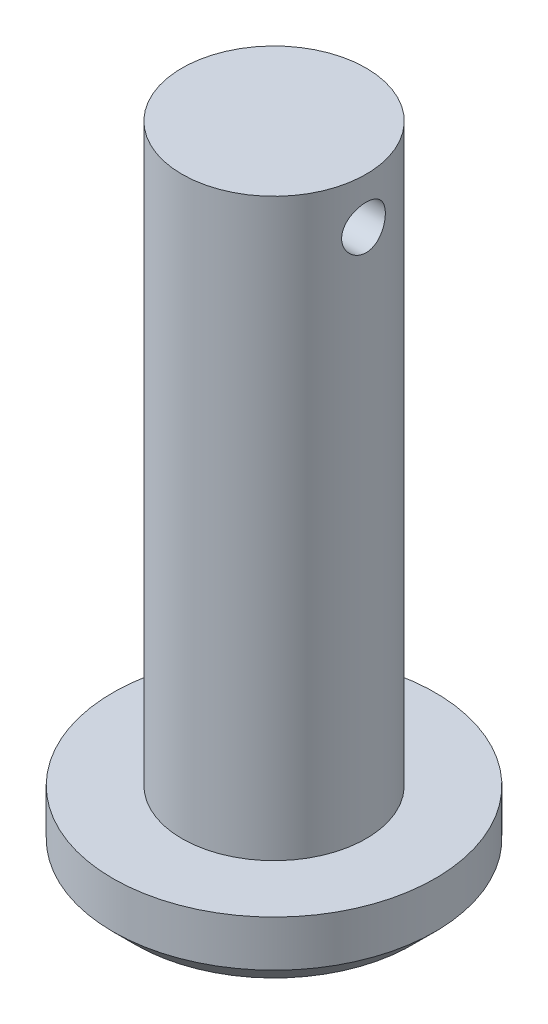
ISO-10303-21;
HEADER;
FILE_DESCRIPTION(('STEP AP214'),'2;1');
FILE_NAME('part.step','',(''),(''),'','','');
FILE_SCHEMA(('AUTOMOTIVE_DESIGN { 1 0 10303 214 1 1 1 1 }'));
ENDSEC;
DATA;
#1=APPLICATION_CONTEXT('core data for automotive mechanical design processes');
#2=APPLICATION_PROTOCOL_DEFINITION('international standard','automotive_design',2000,#1);
#3=PRODUCT_CONTEXT('',#1,'mechanical');
#4=PRODUCT('Part','Part','',(#3));
#5=PRODUCT_RELATED_PRODUCT_CATEGORY('part','',(#4));
#6=PRODUCT_DEFINITION_FORMATION('','',#4);
#7=PRODUCT_DEFINITION_CONTEXT('part definition',#1,'design');
#8=PRODUCT_DEFINITION('design','',#6,#7);
#9=PRODUCT_DEFINITION_SHAPE('','',#8);
#10=(LENGTH_UNIT() NAMED_UNIT(*) SI_UNIT(.MILLI.,.METRE.));
#11=(NAMED_UNIT(*) PLANE_ANGLE_UNIT() SI_UNIT($,.RADIAN.));
#12=(NAMED_UNIT(*) SI_UNIT($,.STERADIAN.) SOLID_ANGLE_UNIT());
#13=UNCERTAINTY_MEASURE_WITH_UNIT(LENGTH_MEASURE(1.E-05),#10,'distance_accuracy_value','');
#14=(GEOMETRIC_REPRESENTATION_CONTEXT(3) GLOBAL_UNCERTAINTY_ASSIGNED_CONTEXT((#13)) GLOBAL_UNIT_ASSIGNED_CONTEXT((#10,
#11,#12)) REPRESENTATION_CONTEXT('',''));
#15=CARTESIAN_POINT('',(0.,0.,0.));
#16=DIRECTION('',(0.,0.,1.));
#17=DIRECTION('',(1.,0.,0.));
#18=AXIS2_PLACEMENT_3D('',#15,#16,#17);
#19=CARTESIAN_POINT('',(0.,-3.,0.));
#20=DIRECTION('',(0.,1.,0.));
#21=DIRECTION('',(0.,0.,1.));
#22=AXIS2_PLACEMENT_3D('',#19,#20,#21);
#23=CYLINDRICAL_SURFACE('',#22,7.);
#24=CARTESIAN_POINT('',(0.,-2.,0.));
#25=DIRECTION('',(0.,1.,0.));
#26=DIRECTION('',(0.,0.,1.));
#27=AXIS2_PLACEMENT_3D('',#24,#25,#26);
#28=CIRCLE('',#27,7.);
#29=CARTESIAN_POINT('',(0.,-2.,7.));
#30=VERTEX_POINT('',#29);
#31=EDGE_CURVE('E41',#30,#30,#28,.T.);
#32=ORIENTED_EDGE('',*,*,#31,.T.);
#33=EDGE_LOOP('',(#32));
#34=FACE_BOUND('',#33,.T.);
#35=CARTESIAN_POINT('',(0.,0.,0.));
#36=DIRECTION('',(0.,1.,0.));
#37=DIRECTION('',(0.,0.,1.));
#38=AXIS2_PLACEMENT_3D('',#35,#36,#37);
#39=CIRCLE('',#38,7.);
#40=CARTESIAN_POINT('',(0.,0.,7.));
#41=VERTEX_POINT('',#40);
#42=EDGE_CURVE('E98',#41,#41,#39,.T.);
#43=ORIENTED_EDGE('',*,*,#42,.F.);
#44=EDGE_LOOP('',(#43));
#45=FACE_BOUND('',#44,.T.);
#46=ADVANCED_FACE('F33',(#34,#45),#23,.T.);
#47=CARTESIAN_POINT('',(0.,-3.,0.));
#48=DIRECTION('',(0.,1.,0.));
#49=DIRECTION('',(0.,0.,1.));
#50=AXIS2_PLACEMENT_3D('',#47,#48,#49);
#51=PLANE('',#50);
#52=CARTESIAN_POINT('',(0.,-3.,0.));
#53=DIRECTION('',(0.,1.,0.));
#54=DIRECTION('',(0.,0.,1.));
#55=AXIS2_PLACEMENT_3D('',#52,#53,#54);
#56=CIRCLE('',#55,6.);
#57=CARTESIAN_POINT('',(0.,-3.,6.));
#58=VERTEX_POINT('',#57);
#59=EDGE_CURVE('E10',#58,#58,#56,.F.);
#60=ORIENTED_EDGE('',*,*,#59,.T.);
#61=EDGE_LOOP('',(#60));
#62=FACE_BOUND('',#61,.T.);
#63=ADVANCED_FACE('F83',(#62),#51,.F.);
#64=CARTESIAN_POINT('',(0.,0.,0.));
#65=DIRECTION('',(0.,1.,0.));
#66=DIRECTION('',(0.,0.,1.));
#67=AXIS2_PLACEMENT_3D('',#64,#65,#66);
#68=PLANE('',#67);
#69=CARTESIAN_POINT('',(0.,0.,0.));
#70=DIRECTION('',(0.,1.,0.));
#71=DIRECTION('',(0.,0.,1.));
#72=AXIS2_PLACEMENT_3D('',#69,#70,#71);
#73=CIRCLE('',#72,4.);
#74=CARTESIAN_POINT('',(0.,0.,4.));
#75=VERTEX_POINT('',#74);
#76=EDGE_CURVE('E49',#75,#75,#73,.T.);
#77=ORIENTED_EDGE('',*,*,#76,.F.);
#78=EDGE_LOOP('',(#77));
#79=FACE_BOUND('',#78,.T.);
#80=ORIENTED_EDGE('',*,*,#42,.T.);
#81=EDGE_LOOP('',(#80));
#82=FACE_BOUND('',#81,.T.);
#83=ADVANCED_FACE('F79',(#79,#82),#68,.T.);
#84=CARTESIAN_POINT('',(0.,25.,0.));
#85=DIRECTION('',(0.,-1.,0.));
#86=DIRECTION('',(0.,0.,-1.));
#87=AXIS2_PLACEMENT_3D('',#84,#85,#86);
#88=CYLINDRICAL_SURFACE('',#87,4.);
#89=CARTESIAN_POINT('',(3.88555015409659,23.,0.95));
#90=CARTESIAN_POINT('',(3.88555119658447,23.0525480392455,0.949998366385795));
#91=CARTESIAN_POINT('',(3.88662777084838,23.1051147727544,0.945625214347679));
#92=CARTESIAN_POINT('',(3.89080804298714,23.2087447799121,0.928272377596758));
#93=CARTESIAN_POINT('',(3.89391303822829,23.2598070694678,0.915287184591519));
#94=CARTESIAN_POINT('',(3.90177911038668,23.3589142527183,0.881149268434964));
#95=CARTESIAN_POINT('',(3.90653818260282,23.4069627162588,0.860006428752927));
#96=CARTESIAN_POINT('',(3.91717372245091,23.4988341555609,0.810182790178994));
#97=CARTESIAN_POINT('',(3.92305020873714,23.5426570607621,0.781501865442135));
#98=CARTESIAN_POINT('',(3.93538912387704,23.6257047708797,0.716807680169348));
#99=CARTESIAN_POINT('',(3.94186015741135,23.6648332417439,0.680672374015562));
#100=CARTESIAN_POINT('',(3.9545841222894,23.7365347549474,0.602358310692681));
#101=CARTESIAN_POINT('',(3.96083703468498,23.7691072289344,0.560179030101748));
#102=CARTESIAN_POINT('',(3.97251482162618,23.8271608764587,0.470320149807636));
#103=CARTESIAN_POINT('',(3.97792835730083,23.8525482278961,0.422578335238793));
#104=CARTESIAN_POINT('',(3.98721966649302,23.8949022119194,0.32335528155475));
#105=CARTESIAN_POINT('',(3.99109764390069,23.9118699625286,0.271874539966056));
#106=CARTESIAN_POINT('',(3.99682007391831,23.9365968296962,0.167638263268297));
#107=CARTESIAN_POINT('',(3.9987005602098,23.9445193216035,0.114923496016071));
#108=CARTESIAN_POINT('',(4.00034139793232,23.9514427687046,0.00888180404807678));
#109=CARTESIAN_POINT('',(4.00010203342113,23.9504449192147,-0.0444450376939718));
#110=CARTESIAN_POINT('',(3.99755726020232,23.9396752466734,-0.149066874564704));
#111=CARTESIAN_POINT('',(3.99529335320897,23.9300796635352,-0.200381171649832));
#112=CARTESIAN_POINT('',(3.98900175091233,23.9026691761224,-0.300649456938191));
#113=CARTESIAN_POINT('',(3.98497396714895,23.8848538596181,-0.349603326627059));
#114=CARTESIAN_POINT('',(3.97554232938614,23.8413615691556,-0.44423575484939));
#115=CARTESIAN_POINT('',(3.97012726618428,23.8156201933928,-0.489883551839132));
#116=CARTESIAN_POINT('',(3.9585111535359,23.7570549763501,-0.576274415240526));
#117=CARTESIAN_POINT('',(3.95230997950376,23.7242300118576,-0.617016702209653));
#118=CARTESIAN_POINT('',(3.93962089598158,23.6514783712545,-0.693490090116478));
#119=CARTESIAN_POINT('',(3.93312968327407,23.6113975533269,-0.729074148815464));
#120=CARTESIAN_POINT('',(3.92073236244736,23.5257695548755,-0.793046400952027));
#121=CARTESIAN_POINT('',(3.9148262764987,23.4802221673671,-0.821434321790251));
#122=CARTESIAN_POINT('',(3.90425726360328,23.3846867372124,-0.870290427474961));
#123=CARTESIAN_POINT('',(3.89959941652524,23.3346816204803,-0.890726398768537));
#124=CARTESIAN_POINT('',(3.89212129602027,23.2318090288732,-0.922857992618091));
#125=CARTESIAN_POINT('',(3.88930067238144,23.1789421015994,-0.934555281006106));
#126=CARTESIAN_POINT('',(3.88588903434823,23.0732019490553,-0.948640150073782));
#127=CARTESIAN_POINT('',(3.88524629151521,23.0203591352807,-0.951243768155168));
#128=CARTESIAN_POINT('',(3.88612290482417,22.9149943332638,-0.947656130744841));
#129=CARTESIAN_POINT('',(3.8876420832732,22.8624723190107,-0.941465598063381));
#130=CARTESIAN_POINT('',(3.89262209093516,22.7600212801005,-0.920654019411597));
#131=CARTESIAN_POINT('',(3.89605458670746,22.7100657754889,-0.906155910822367));
#132=CARTESIAN_POINT('',(3.90444812874248,22.6132935436561,-0.869275695627036));
#133=CARTESIAN_POINT('',(3.90940934212708,22.5664771602905,-0.846892726996903));
#134=CARTESIAN_POINT('',(3.92041218658714,22.4763886277408,-0.794416189355452));
#135=CARTESIAN_POINT('',(3.92647156008142,22.4331948777974,-0.764191829227684));
#136=CARTESIAN_POINT('',(3.93894313562688,22.3524129550158,-0.697058205673848));
#137=CARTESIAN_POINT('',(3.94535538966067,22.3148256110961,-0.660147955508432));
#138=CARTESIAN_POINT('',(3.95798355973407,22.2454635738074,-0.579704501599114));
#139=CARTESIAN_POINT('',(3.96419189239773,22.2138374472024,-0.536041793133145));
#140=CARTESIAN_POINT('',(3.9755635343327,22.1583676531393,-0.44389890135051));
#141=CARTESIAN_POINT('',(3.98072689630454,22.1345235931746,-0.395418961162978));
#142=CARTESIAN_POINT('',(3.98939535866095,22.0954908840695,-0.295342502269509));
#143=CARTESIAN_POINT('',(3.99291186453037,22.0802425496044,-0.243770296420001));
#144=CARTESIAN_POINT('',(3.99794009464609,22.0586515875868,-0.138701882707194));
#145=CARTESIAN_POINT('',(3.99945216577429,22.052307419093,-0.0852060093947546));
#146=CARTESIAN_POINT('',(4.0002885918271,22.0487844156731,0.020789606420504));
#147=CARTESIAN_POINT('',(3.99966552523578,22.0513853113033,0.0732817299154627));
#148=CARTESIAN_POINT('',(3.99641664154496,22.0651789935283,0.177058003591496));
#149=CARTESIAN_POINT('',(3.99379087371965,22.0763715687347,0.228342183460656));
#150=CARTESIAN_POINT('',(3.98683803404943,22.1069177268473,0.328041015431034));
#151=CARTESIAN_POINT('',(3.98251853700102,22.1262350015487,0.376467354169049));
#152=CARTESIAN_POINT('',(3.97263562042283,22.1724485471967,0.469418177614435));
#153=CARTESIAN_POINT('',(3.96707205816221,22.1993456878688,0.51394221379652));
#154=CARTESIAN_POINT('',(3.95515134706186,22.2606465162429,0.598881797617394));
#155=CARTESIAN_POINT('',(3.94877946304627,22.2952019731106,0.63918575089086));
#156=CARTESIAN_POINT('',(3.93603169626298,22.3705390503303,0.713497872024468));
#157=CARTESIAN_POINT('',(3.92965581289578,22.4113222105532,0.747504478179234));
#158=CARTESIAN_POINT('',(3.91750394866502,22.4987618594738,0.808800126119141));
#159=CARTESIAN_POINT('',(3.91173951716314,22.5455036798704,0.835969891162669));
#160=CARTESIAN_POINT('',(3.90161403146148,22.6430200906236,0.882024967652499));
#161=CARTESIAN_POINT('',(3.89725188640607,22.6937915077814,0.900916722837271));
#162=CARTESIAN_POINT('',(3.89115917080241,22.7871132481922,0.926831562053166));
#163=CARTESIAN_POINT('',(3.8890708196325,22.8291904802568,0.935501763545243));
#164=CARTESIAN_POINT('',(3.88626593244295,22.9141743558729,0.947086452900724));
#165=CARTESIAN_POINT('',(3.88554930263575,22.9570809425169,0.95000133426828));
#166=CARTESIAN_POINT('',(3.88555015409659,23.,0.95));
#167=B_SPLINE_CURVE_WITH_KNOTS('',3,(#89,#90,#91,#92,#93,#94,#95,#96,#97,#98,#99,#100,#101,#102,
#103,#104,#105,#106,#107,#108,#109,#110,#111,#112,#113,#114,#115,#116,#117,#118,#119,#120,#121,
#122,#123,#124,#125,#126,#127,#128,#129,#130,#131,#132,#133,#134,#135,#136,#137,#138,#139,#140,
#141,#142,#143,#144,#145,#146,#147,#148,#149,#150,#151,#152,#153,#154,#155,#156,#157,#158,#159,
#160,#161,#162,#163,#164,#165,#166),.UNSPECIFIED.,.T.,.F.,(4,2,2,2,2,2,2,2,2,2,2,2,2,2,2,2,2,2,
2,2,2,2,2,2,2,2,2,2,2,2,2,2,2,2,2,2,2,2,4),(0.,0.157486642863022,0.315074112017903,
0.472471251182699,0.629871018189381,0.790087903096117,0.950318671542171,1.11255417690157,
1.27476813353941,1.43400337941496,1.59321728825759,1.74924039239736,1.90527132213905,
2.06260509144077,2.21996382680071,2.38117364286886,2.54238956486874,2.70425194156267,
2.8660834549805,3.02404318201929,3.18198992675794,3.33765757241443,3.49334224195185,
3.6518123849235,3.81030593484878,3.97233924111705,4.13436437359815,4.29525015428154,
4.45610808888229,4.61303359925174,4.76995524877091,4.92618296476412,5.08242861387174,
5.24210285634096,5.4018166442159,5.5641489688674,5.72635470592196,5.85499205495925,
5.98362060846773),.UNSPECIFIED.);
#168=CARTESIAN_POINT('',(3.88555015409659,23.,0.95));
#169=VERTEX_POINT('',#168);
#170=EDGE_CURVE('E52',#169,#169,#167,.T.);
#171=ORIENTED_EDGE('',*,*,#170,.T.);
#172=EDGE_LOOP('',(#171));
#173=FACE_BOUND('',#172,.T.);
#174=CARTESIAN_POINT('',(-3.88555015409659,23.,0.95));
#175=CARTESIAN_POINT('',(-3.88555119658447,22.9474519607545,0.949998366385795));
#176=CARTESIAN_POINT('',(-3.88662777084838,22.8948852272456,0.945625214347679));
#177=CARTESIAN_POINT('',(-3.89080804298714,22.7912552200879,0.928272377596758));
#178=CARTESIAN_POINT('',(-3.89391303822829,22.7401929305322,0.915287184591519));
#179=CARTESIAN_POINT('',(-3.90177911038668,22.6410857472817,0.881149268434964));
#180=CARTESIAN_POINT('',(-3.90653818260282,22.5930372837412,0.860006428752925));
#181=CARTESIAN_POINT('',(-3.91717372245091,22.5011658444391,0.810182790178992));
#182=CARTESIAN_POINT('',(-3.92305020873714,22.4573429392379,0.781501865442134));
#183=CARTESIAN_POINT('',(-3.93538912387704,22.3742952291203,0.716807680169349));
#184=CARTESIAN_POINT('',(-3.94186015741135,22.3351667582561,0.680672374015562));
#185=CARTESIAN_POINT('',(-3.9545841222894,22.2634652450526,0.602358310692681));
#186=CARTESIAN_POINT('',(-3.96083703468498,22.2308927710656,0.560179030101748));
#187=CARTESIAN_POINT('',(-3.97251482162618,22.1728391235413,0.470320149807636));
#188=CARTESIAN_POINT('',(-3.97792835730083,22.1474517721039,0.422578335238793));
#189=CARTESIAN_POINT('',(-3.98721966649302,22.1050977880806,0.32335528155475));
#190=CARTESIAN_POINT('',(-3.99109764390069,22.0881300374714,0.271874539966056));
#191=CARTESIAN_POINT('',(-3.99682007391831,22.0634031703038,0.167638263268297));
#192=CARTESIAN_POINT('',(-3.9987005602098,22.0554806783965,0.114923496016071));
#193=CARTESIAN_POINT('',(-4.00034139793232,22.0485572312954,0.00888180404807678));
#194=CARTESIAN_POINT('',(-4.00010203342113,22.0495550807853,-0.0444450376939718));
#195=CARTESIAN_POINT('',(-3.99755726020232,22.0603247533266,-0.149066874564704));
#196=CARTESIAN_POINT('',(-3.99529335320897,22.0699203364648,-0.200381171649832));
#197=CARTESIAN_POINT('',(-3.98900175091233,22.0973308238776,-0.300649456938191));
#198=CARTESIAN_POINT('',(-3.98497396714895,22.1151461403819,-0.349603326627059));
#199=CARTESIAN_POINT('',(-3.97554232938614,22.1586384308444,-0.44423575484939));
#200=CARTESIAN_POINT('',(-3.97012726618428,22.1843798066072,-0.489883551839132));
#201=CARTESIAN_POINT('',(-3.9585111535359,22.2429450236499,-0.576274415240526));
#202=CARTESIAN_POINT('',(-3.95230997950376,22.2757699881424,-0.617016702209653));
#203=CARTESIAN_POINT('',(-3.93962089598158,22.3485216287455,-0.693490090116478));
#204=CARTESIAN_POINT('',(-3.93312968327407,22.3886024466731,-0.729074148815464));
#205=CARTESIAN_POINT('',(-3.92073236244736,22.4742304451245,-0.793046400952027));
#206=CARTESIAN_POINT('',(-3.9148262764987,22.5197778326329,-0.821434321790251));
#207=CARTESIAN_POINT('',(-3.90425726360328,22.6153132627876,-0.870290427474961));
#208=CARTESIAN_POINT('',(-3.89959941652524,22.6653183795197,-0.890726398768537));
#209=CARTESIAN_POINT('',(-3.89212129602027,22.7681909711268,-0.922857992618091));
#210=CARTESIAN_POINT('',(-3.88930067238144,22.8210578984006,-0.934555281006106));
#211=CARTESIAN_POINT('',(-3.88588903434823,22.9267980509447,-0.948640150073782));
#212=CARTESIAN_POINT('',(-3.88524629151521,22.9796408647193,-0.951243768155168));
#213=CARTESIAN_POINT('',(-3.88612290482417,23.0850056667362,-0.94765613074484));
#214=CARTESIAN_POINT('',(-3.8876420832732,23.1375276809893,-0.941465598063381));
#215=CARTESIAN_POINT('',(-3.89262209093516,23.2399787198995,-0.920654019411597));
#216=CARTESIAN_POINT('',(-3.89605458670746,23.2899342245111,-0.906155910822368));
#217=CARTESIAN_POINT('',(-3.90444812874248,23.3867064563439,-0.869275695627038));
#218=CARTESIAN_POINT('',(-3.90940934212708,23.4335228397095,-0.846892726996903));
#219=CARTESIAN_POINT('',(-3.92041218658714,23.5236113722592,-0.794416189355451));
#220=CARTESIAN_POINT('',(-3.92647156008142,23.5668051222026,-0.764191829227683));
#221=CARTESIAN_POINT('',(-3.93894313562688,23.6475870449842,-0.697058205673848));
#222=CARTESIAN_POINT('',(-3.94535538966067,23.6851743889039,-0.660147955508432));
#223=CARTESIAN_POINT('',(-3.95798355973407,23.7545364261926,-0.579704501599114));
#224=CARTESIAN_POINT('',(-3.96419189239773,23.7861625527976,-0.536041793133145));
#225=CARTESIAN_POINT('',(-3.9755635343327,23.8416323468607,-0.44389890135051));
#226=CARTESIAN_POINT('',(-3.98072689630454,23.8654764068254,-0.395418961162978));
#227=CARTESIAN_POINT('',(-3.98939535866095,23.9045091159305,-0.295342502269509));
#228=CARTESIAN_POINT('',(-3.99291186453037,23.9197574503956,-0.243770296420001));
#229=CARTESIAN_POINT('',(-3.99794009464609,23.9413484124132,-0.138701882707194));
#230=CARTESIAN_POINT('',(-3.99945216577429,23.947692580907,-0.0852060093947549));
#231=CARTESIAN_POINT('',(-4.0002885918271,23.9512155843269,0.020789606420504));
#232=CARTESIAN_POINT('',(-3.99966552523578,23.9486146886967,0.0732817299154627));
#233=CARTESIAN_POINT('',(-3.99641664154496,23.9348210064717,0.177058003591496));
#234=CARTESIAN_POINT('',(-3.99379087371965,23.9236284312653,0.228342183460656));
#235=CARTESIAN_POINT('',(-3.98683803404943,23.8930822731527,0.328041015431034));
#236=CARTESIAN_POINT('',(-3.98251853700102,23.8737649984513,0.376467354169049));
#237=CARTESIAN_POINT('',(-3.97263562042283,23.8275514528033,0.469418177614435));
#238=CARTESIAN_POINT('',(-3.96707205816221,23.8006543121312,0.51394221379652));
#239=CARTESIAN_POINT('',(-3.95515134706186,23.7393534837571,0.598881797617395));
#240=CARTESIAN_POINT('',(-3.94877946304627,23.7047980268894,0.639185750890861));
#241=CARTESIAN_POINT('',(-3.93603169626298,23.6294609496697,0.713497872024469));
#242=CARTESIAN_POINT('',(-3.92965581289578,23.5886777894468,0.747504478179235));
#243=CARTESIAN_POINT('',(-3.91750394866502,23.5012381405262,0.808800126119141));
#244=CARTESIAN_POINT('',(-3.91173951716314,23.4544963201296,0.835969891162669));
#245=CARTESIAN_POINT('',(-3.90161403146148,23.3569799093764,0.882024967652499));
#246=CARTESIAN_POINT('',(-3.89725188640607,23.3062084922186,0.900916722837271));
#247=CARTESIAN_POINT('',(-3.89115917080241,23.2128867518078,0.926831562053166));
#248=CARTESIAN_POINT('',(-3.8890708196325,23.1708095197432,0.935501763545243));
#249=CARTESIAN_POINT('',(-3.88626593244295,23.0858256441271,0.947086452900724));
#250=CARTESIAN_POINT('',(-3.88554930263575,23.0429190574831,0.95000133426828));
#251=CARTESIAN_POINT('',(-3.88555015409659,23.,0.95));
#252=B_SPLINE_CURVE_WITH_KNOTS('',3,(#174,#175,#176,#177,#178,#179,#180,#181,#182,#183,#184,
#185,#186,#187,#188,#189,#190,#191,#192,#193,#194,#195,#196,#197,#198,#199,#200,#201,#202,#203,
#204,#205,#206,#207,#208,#209,#210,#211,#212,#213,#214,#215,#216,#217,#218,#219,#220,#221,#222,
#223,#224,#225,#226,#227,#228,#229,#230,#231,#232,#233,#234,#235,#236,#237,#238,#239,#240,#241,
#242,#243,#244,#245,#246,#247,#248,#249,#250,#251),.UNSPECIFIED.,.T.,.F.,(4,2,2,2,2,2,2,2,2,2,2,
2,2,2,2,2,2,2,2,2,2,2,2,2,2,2,2,2,2,2,2,2,2,2,2,2,2,2,4),(0.,0.157486642863022,
0.315074112017903,0.472471251182703,0.629871018189381,0.790087903096117,0.95031867154217,
1.11255417690157,1.27476813353941,1.43400337941496,1.59321728825759,1.74924039239736,
1.90527132213905,2.06260509144077,2.21996382680071,2.38117364286886,2.54238956486874,
2.70425194156267,2.8660834549805,3.0240431820193,3.18198992675794,3.33765757241443,
3.49334224195185,3.6518123849235,3.81030593484878,3.97233924111705,4.13436437359815,
4.29525015428154,4.45610808888229,4.61303359925174,4.76995524877091,4.92618296476412,
5.08242861387174,5.24210285634096,5.4018166442159,5.5641489688674,5.72635470592196,
5.85499205495925,5.98362060846773),.UNSPECIFIED.);
#253=CARTESIAN_POINT('',(-3.88555015409659,23.,0.95));
#254=VERTEX_POINT('',#253);
#255=EDGE_CURVE('E45',#254,#254,#252,.T.);
#256=ORIENTED_EDGE('',*,*,#255,.T.);
#257=EDGE_LOOP('',(#256));
#258=FACE_BOUND('',#257,.T.);
#259=CARTESIAN_POINT('',(0.,25.,0.));
#260=DIRECTION('',(0.,1.,0.));
#261=DIRECTION('',(0.,0.,1.));
#262=AXIS2_PLACEMENT_3D('',#259,#260,#261);
#263=CIRCLE('',#262,4.);
#264=CARTESIAN_POINT('',(0.,25.,4.));
#265=VERTEX_POINT('',#264);
#266=EDGE_CURVE('E59',#265,#265,#263,.T.);
#267=ORIENTED_EDGE('',*,*,#266,.F.);
#268=EDGE_LOOP('',(#267));
#269=FACE_BOUND('',#268,.T.);
#270=ORIENTED_EDGE('',*,*,#76,.T.);
#271=EDGE_LOOP('',(#270));
#272=FACE_BOUND('',#271,.T.);
#273=ADVANCED_FACE('F64',(#173,#258,#269,#272),#88,.T.);
#274=CARTESIAN_POINT('',(0.,25.,0.));
#275=DIRECTION('',(0.,1.,0.));
#276=DIRECTION('',(0.,0.,1.));
#277=AXIS2_PLACEMENT_3D('',#274,#275,#276);
#278=PLANE('',#277);
#279=ORIENTED_EDGE('',*,*,#266,.T.);
#280=EDGE_LOOP('',(#279));
#281=FACE_BOUND('',#280,.T.);
#282=ADVANCED_FACE('F71',(#281),#278,.T.);
#283=CARTESIAN_POINT('',(7.,23.,0.));
#284=DIRECTION('',(-1.,0.,0.));
#285=DIRECTION('',(0.,0.,1.));
#286=AXIS2_PLACEMENT_3D('',#283,#284,#285);
#287=CYLINDRICAL_SURFACE('',#286,0.95);
#288=ORIENTED_EDGE('',*,*,#255,.F.);
#289=EDGE_LOOP('',(#288));
#290=FACE_BOUND('',#289,.T.);
#291=ORIENTED_EDGE('',*,*,#170,.F.);
#292=EDGE_LOOP('',(#291));
#293=FACE_BOUND('',#292,.T.);
#294=ADVANCED_FACE('F68',(#290,#293),#287,.F.);
#295=CARTESIAN_POINT('',(0.,-2.,0.));
#296=DIRECTION('',(0.,1.,0.));
#297=DIRECTION('',(0.,0.,1.));
#298=AXIS2_PLACEMENT_3D('',#295,#296,#297);
#299=CONICAL_SURFACE('',#298,7.,0.78539816339745);
#300=ORIENTED_EDGE('',*,*,#59,.F.);
#301=EDGE_LOOP('',(#300));
#302=FACE_BOUND('',#301,.T.);
#303=ORIENTED_EDGE('',*,*,#31,.F.);
#304=EDGE_LOOP('',(#303));
#305=FACE_BOUND('',#304,.T.);
#306=ADVANCED_FACE('F36',(#302,#305),#299,.T.);
#307=CLOSED_SHELL('',(#46,#63,#83,#273,#282,#294,#306));
#308=MANIFOLD_SOLID_BREP('B2',#307);
#309=ADVANCED_BREP_SHAPE_REPRESENTATION('',(#18,#308),#14);
#310=SHAPE_DEFINITION_REPRESENTATION(#9,#309);
ENDSEC;
END-ISO-10303-21;
